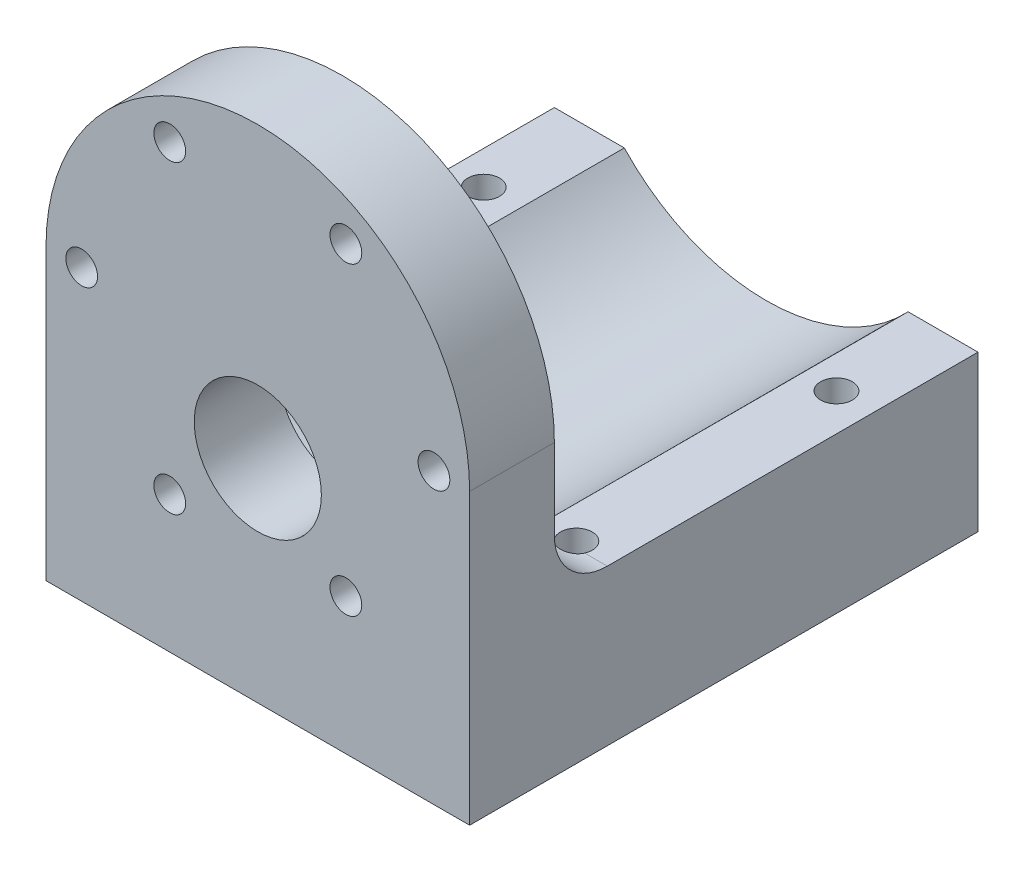
ISO-10303-21;
HEADER;
FILE_DESCRIPTION(('STEP AP214'),'2;1');
FILE_NAME('part.step','',(''),(''),'','','');
FILE_SCHEMA(('AUTOMOTIVE_DESIGN { 1 0 10303 214 1 1 1 1 }'));
ENDSEC;
DATA;
#1=APPLICATION_CONTEXT('core data for automotive mechanical design processes');
#2=APPLICATION_PROTOCOL_DEFINITION('international standard','automotive_design',2000,#1);
#3=PRODUCT_CONTEXT('',#1,'mechanical');
#4=PRODUCT('Part','Part','',(#3));
#5=PRODUCT_RELATED_PRODUCT_CATEGORY('part','',(#4));
#6=PRODUCT_DEFINITION_FORMATION('','',#4);
#7=PRODUCT_DEFINITION_CONTEXT('part definition',#1,'design');
#8=PRODUCT_DEFINITION('design','',#6,#7);
#9=PRODUCT_DEFINITION_SHAPE('','',#8);
#10=(LENGTH_UNIT() NAMED_UNIT(*) SI_UNIT(.MILLI.,.METRE.));
#11=(NAMED_UNIT(*) PLANE_ANGLE_UNIT() SI_UNIT($,.RADIAN.));
#12=(NAMED_UNIT(*) SI_UNIT($,.STERADIAN.) SOLID_ANGLE_UNIT());
#13=UNCERTAINTY_MEASURE_WITH_UNIT(LENGTH_MEASURE(1.E-05),#10,'distance_accuracy_value','');
#14=(GEOMETRIC_REPRESENTATION_CONTEXT(3) GLOBAL_UNCERTAINTY_ASSIGNED_CONTEXT((#13)) GLOBAL_UNIT_ASSIGNED_CONTEXT((#10,
#11,#12)) REPRESENTATION_CONTEXT('',''));
#15=CARTESIAN_POINT('',(0.,0.,0.));
#16=DIRECTION('',(0.,0.,1.));
#17=DIRECTION('',(1.,0.,0.));
#18=AXIS2_PLACEMENT_3D('',#15,#16,#17);
#19=CARTESIAN_POINT('',(20.,27.3,8.));
#20=DIRECTION('',(0.,0.,-1.));
#21=DIRECTION('',(-1.,0.,0.));
#22=AXIS2_PLACEMENT_3D('',#19,#20,#21);
#23=CYLINDRICAL_SURFACE('',#22,20.);
#24=CARTESIAN_POINT('',(20.,27.3,0.));
#25=DIRECTION('',(0.,0.,-1.));
#26=DIRECTION('',(-1.,0.,0.));
#27=AXIS2_PLACEMENT_3D('',#24,#25,#26);
#28=CIRCLE('',#27,20.);
#29=CARTESIAN_POINT('',(0.,27.3,0.));
#30=VERTEX_POINT('',#29);
#31=CARTESIAN_POINT('',(40.,27.3,0.));
#32=VERTEX_POINT('',#31);
#33=EDGE_CURVE('E241',#30,#32,#28,.T.);
#34=ORIENTED_EDGE('',*,*,#33,.F.);
#35=DIRECTION('',(0.,0.,-1.));
#36=VECTOR('',#35,1.);
#37=CARTESIAN_POINT('',(0.,27.3,8.));
#38=LINE('',#37,#36);
#39=CARTESIAN_POINT('',(0.,27.3,8.));
#40=VERTEX_POINT('',#39);
#41=EDGE_CURVE('E271',#40,#30,#38,.T.);
#42=ORIENTED_EDGE('',*,*,#41,.F.);
#43=CARTESIAN_POINT('',(20.,27.3,8.));
#44=DIRECTION('',(0.,0.,-1.));
#45=DIRECTION('',(-1.,0.,0.));
#46=AXIS2_PLACEMENT_3D('',#43,#44,#45);
#47=CIRCLE('',#46,20.);
#48=CARTESIAN_POINT('',(40.,27.3,8.));
#49=VERTEX_POINT('',#48);
#50=EDGE_CURVE('E245',#40,#49,#47,.T.);
#51=ORIENTED_EDGE('',*,*,#50,.T.);
#52=DIRECTION('',(0.,0.,-1.));
#53=VECTOR('',#52,1.);
#54=CARTESIAN_POINT('',(40.,27.3,8.));
#55=LINE('',#54,#53);
#56=EDGE_CURVE('E261',#49,#32,#55,.T.);
#57=ORIENTED_EDGE('',*,*,#56,.T.);
#58=EDGE_LOOP('',(#34,#42,#51,#57));
#59=FACE_BOUND('',#58,.T.);
#60=ADVANCED_FACE('F42',(#59),#23,.T.);
#61=CARTESIAN_POINT('',(0.,0.,8.));
#62=DIRECTION('',(-1.,0.,0.));
#63=DIRECTION('',(0.,0.,1.));
#64=AXIS2_PLACEMENT_3D('',#61,#62,#63);
#65=PLANE('',#64);
#66=DIRECTION('',(0.,1.,0.));
#67=VECTOR('',#66,1.);
#68=CARTESIAN_POINT('',(0.,0.,0.));
#69=LINE('',#68,#67);
#70=CARTESIAN_POINT('',(0.,19.687746699167,0.));
#71=VERTEX_POINT('',#70);
#72=EDGE_CURVE('E250',#71,#30,#69,.T.);
#73=ORIENTED_EDGE('',*,*,#72,.F.);
#74=CARTESIAN_POINT('',(0.,19.687746699167,-5.));
#75=DIRECTION('',(-1.,0.,0.));
#76=DIRECTION('',(0.,0.,1.));
#77=AXIS2_PLACEMENT_3D('',#74,#75,#76);
#78=CIRCLE('',#77,5.);
#79=CARTESIAN_POINT('',(0.,14.687746699167,-5.));
#80=VERTEX_POINT('',#79);
#81=EDGE_CURVE('E12',#71,#80,#78,.F.);
#82=ORIENTED_EDGE('',*,*,#81,.T.);
#83=DIRECTION('',(0.,0.,1.));
#84=VECTOR('',#83,1.);
#85=CARTESIAN_POINT('',(0.,14.687746699167,-40.));
#86=LINE('',#85,#84);
#87=CARTESIAN_POINT('',(0.,14.687746699167,-40.));
#88=VERTEX_POINT('',#87);
#89=EDGE_CURVE('E183',#88,#80,#86,.T.);
#90=ORIENTED_EDGE('',*,*,#89,.F.);
#91=DIRECTION('',(0.,1.,0.));
#92=VECTOR('',#91,1.);
#93=CARTESIAN_POINT('',(0.,0.,-40.));
#94=LINE('',#93,#92);
#95=CARTESIAN_POINT('',(0.,0.,-40.));
#96=VERTEX_POINT('',#95);
#97=EDGE_CURVE('E175',#96,#88,#94,.T.);
#98=ORIENTED_EDGE('',*,*,#97,.F.);
#99=DIRECTION('',(0.,0.,-1.));
#100=VECTOR('',#99,1.);
#101=CARTESIAN_POINT('',(0.,0.,8.));
#102=LINE('',#101,#100);
#103=CARTESIAN_POINT('',(0.,0.,8.));
#104=VERTEX_POINT('',#103);
#105=EDGE_CURVE('E276',#104,#96,#102,.T.);
#106=ORIENTED_EDGE('',*,*,#105,.F.);
#107=DIRECTION('',(0.,1.,0.));
#108=VECTOR('',#107,1.);
#109=CARTESIAN_POINT('',(0.,0.,8.));
#110=LINE('',#109,#108);
#111=EDGE_CURVE('E257',#104,#40,#110,.T.);
#112=ORIENTED_EDGE('',*,*,#111,.T.);
#113=ORIENTED_EDGE('',*,*,#41,.T.);
#114=EDGE_LOOP('',(#73,#82,#90,#98,#106,#112,#113));
#115=FACE_BOUND('',#114,.T.);
#116=ADVANCED_FACE('F363',(#115),#65,.T.);
#117=CARTESIAN_POINT('',(0.,0.,8.));
#118=DIRECTION('',(0.,1.,0.));
#119=DIRECTION('',(0.,0.,1.));
#120=AXIS2_PLACEMENT_3D('',#117,#118,#119);
#121=PLANE('',#120);
#122=CARTESIAN_POINT('',(36.487813402303,0.,-30.1477890218393));
#123=DIRECTION('',(0.,1.,0.));
#124=DIRECTION('',(0.,0.,1.));
#125=AXIS2_PLACEMENT_3D('',#122,#123,#124);
#126=CIRCLE('',#125,1.5);
#127=CARTESIAN_POINT('',(36.487813402303,0.,-28.6477890218393));
#128=VERTEX_POINT('',#127);
#129=EDGE_CURVE('E420',#128,#128,#126,.T.);
#130=ORIENTED_EDGE('',*,*,#129,.T.);
#131=EDGE_LOOP('',(#130));
#132=FACE_BOUND('',#131,.T.);
#133=CARTESIAN_POINT('',(3.17462201183361,0.,-30.1477890218393));
#134=DIRECTION('',(0.,1.,0.));
#135=DIRECTION('',(0.,0.,1.));
#136=AXIS2_PLACEMENT_3D('',#133,#134,#135);
#137=CIRCLE('',#136,1.5);
#138=CARTESIAN_POINT('',(3.17462201183361,0.,-28.6477890218393));
#139=VERTEX_POINT('',#138);
#140=EDGE_CURVE('E407',#139,#139,#137,.T.);
#141=ORIENTED_EDGE('',*,*,#140,.T.);
#142=EDGE_LOOP('',(#141));
#143=FACE_BOUND('',#142,.T.);
#144=CARTESIAN_POINT('',(3.17462201183361,0.,-5.58616004514079));
#145=DIRECTION('',(0.,1.,0.));
#146=DIRECTION('',(0.,0.,1.));
#147=AXIS2_PLACEMENT_3D('',#144,#145,#146);
#148=CIRCLE('',#147,1.5);
#149=CARTESIAN_POINT('',(3.17462201183361,0.,-4.08616004514079));
#150=VERTEX_POINT('',#149);
#151=EDGE_CURVE('E406',#150,#150,#148,.T.);
#152=ORIENTED_EDGE('',*,*,#151,.T.);
#153=EDGE_LOOP('',(#152));
#154=FACE_BOUND('',#153,.T.);
#155=CARTESIAN_POINT('',(36.487813402303,0.,-5.58616004514079));
#156=DIRECTION('',(0.,1.,0.));
#157=DIRECTION('',(0.,0.,1.));
#158=AXIS2_PLACEMENT_3D('',#155,#156,#157);
#159=CIRCLE('',#158,1.5);
#160=CARTESIAN_POINT('',(36.487813402303,0.,-4.08616004514078));
#161=VERTEX_POINT('',#160);
#162=EDGE_CURVE('E163',#161,#161,#159,.T.);
#163=ORIENTED_EDGE('',*,*,#162,.T.);
#164=EDGE_LOOP('',(#163));
#165=FACE_BOUND('',#164,.T.);
#166=ORIENTED_EDGE('',*,*,#105,.T.);
#167=DIRECTION('',(-1.,0.,0.));
#168=VECTOR('',#167,1.);
#169=CARTESIAN_POINT('',(0.,0.,-40.));
#170=LINE('',#169,#168);
#171=CARTESIAN_POINT('',(40.,0.,-40.));
#172=VERTEX_POINT('',#171);
#173=EDGE_CURVE('E171',#172,#96,#170,.T.);
#174=ORIENTED_EDGE('',*,*,#173,.F.);
#175=DIRECTION('',(0.,0.,-1.));
#176=VECTOR('',#175,1.);
#177=CARTESIAN_POINT('',(40.,0.,8.));
#178=LINE('',#177,#176);
#179=CARTESIAN_POINT('',(40.,0.,8.));
#180=VERTEX_POINT('',#179);
#181=EDGE_CURVE('E279',#180,#172,#178,.T.);
#182=ORIENTED_EDGE('',*,*,#181,.F.);
#183=DIRECTION('',(1.,0.,0.));
#184=VECTOR('',#183,1.);
#185=CARTESIAN_POINT('',(0.,0.,8.));
#186=LINE('',#185,#184);
#187=EDGE_CURVE('E254',#104,#180,#186,.T.);
#188=ORIENTED_EDGE('',*,*,#187,.F.);
#189=EDGE_LOOP('',(#166,#174,#182,#188));
#190=FACE_BOUND('',#189,.T.);
#191=ADVANCED_FACE('F368',(#132,#143,#154,#165,#190),#121,.F.);
#192=CARTESIAN_POINT('',(40.,27.3,8.));
#193=DIRECTION('',(1.,0.,0.));
#194=DIRECTION('',(0.,0.,-1.));
#195=AXIS2_PLACEMENT_3D('',#192,#193,#194);
#196=PLANE('',#195);
#197=DIRECTION('',(0.,-1.,0.));
#198=VECTOR('',#197,1.);
#199=CARTESIAN_POINT('',(40.,27.3,0.));
#200=LINE('',#199,#198);
#201=CARTESIAN_POINT('',(40.,19.687746699167,0.));
#202=VERTEX_POINT('',#201);
#203=EDGE_CURVE('E265',#32,#202,#200,.T.);
#204=ORIENTED_EDGE('',*,*,#203,.F.);
#205=ORIENTED_EDGE('',*,*,#56,.F.);
#206=DIRECTION('',(0.,-1.,0.));
#207=VECTOR('',#206,1.);
#208=CARTESIAN_POINT('',(40.,27.3,8.));
#209=LINE('',#208,#207);
#210=EDGE_CURVE('E249',#49,#180,#209,.T.);
#211=ORIENTED_EDGE('',*,*,#210,.T.);
#212=ORIENTED_EDGE('',*,*,#181,.T.);
#213=DIRECTION('',(0.,-1.,0.));
#214=VECTOR('',#213,1.);
#215=CARTESIAN_POINT('',(40.,0.,-40.));
#216=LINE('',#215,#214);
#217=CARTESIAN_POINT('',(40.,14.687746699167,-40.));
#218=VERTEX_POINT('',#217);
#219=EDGE_CURVE('E154',#218,#172,#216,.T.);
#220=ORIENTED_EDGE('',*,*,#219,.F.);
#221=DIRECTION('',(0.,0.,1.));
#222=VECTOR('',#221,1.);
#223=CARTESIAN_POINT('',(40.,14.687746699167,-40.));
#224=LINE('',#223,#222);
#225=CARTESIAN_POINT('',(40.,14.687746699167,-5.));
#226=VERTEX_POINT('',#225);
#227=EDGE_CURVE('E144',#218,#226,#224,.T.);
#228=ORIENTED_EDGE('',*,*,#227,.T.);
#229=CARTESIAN_POINT('',(40.,19.687746699167,-5.));
#230=DIRECTION('',(1.,0.,0.));
#231=DIRECTION('',(0.,0.,-1.));
#232=AXIS2_PLACEMENT_3D('',#229,#230,#231);
#233=CIRCLE('',#232,5.);
#234=EDGE_CURVE('E300',#226,#202,#233,.F.);
#235=ORIENTED_EDGE('',*,*,#234,.T.);
#236=EDGE_LOOP('',(#204,#205,#211,#212,#220,#228,#235));
#237=FACE_BOUND('',#236,.T.);
#238=ADVANCED_FACE('F386',(#237),#196,.T.);
#239=CARTESIAN_POINT('',(20.,27.3,8.));
#240=DIRECTION('',(0.,0.,-1.));
#241=DIRECTION('',(-1.,0.,0.));
#242=AXIS2_PLACEMENT_3D('',#239,#240,#241);
#243=PLANE('',#242);
#244=CARTESIAN_POINT('',(3.36999999999998,27.3,8.));
#245=DIRECTION('',(0.,0.,1.));
#246=DIRECTION('',(1.,0.,0.));
#247=AXIS2_PLACEMENT_3D('',#244,#245,#246);
#248=CIRCLE('',#247,1.5);
#249=CARTESIAN_POINT('',(4.86999999999998,27.3,8.));
#250=VERTEX_POINT('',#249);
#251=EDGE_CURVE('E205',#250,#250,#248,.T.);
#252=ORIENTED_EDGE('',*,*,#251,.F.);
#253=EDGE_LOOP('',(#252));
#254=FACE_BOUND('',#253,.T.);
#255=CARTESIAN_POINT('',(11.6850000000003,41.7020024649359,8.));
#256=DIRECTION('',(0.,0.,1.));
#257=DIRECTION('',(1.,0.,0.));
#258=AXIS2_PLACEMENT_3D('',#255,#256,#257);
#259=CIRCLE('',#258,1.5);
#260=CARTESIAN_POINT('',(13.1850000000003,41.7020024649359,8.));
#261=VERTEX_POINT('',#260);
#262=EDGE_CURVE('E214',#261,#261,#259,.T.);
#263=ORIENTED_EDGE('',*,*,#262,.F.);
#264=EDGE_LOOP('',(#263));
#265=FACE_BOUND('',#264,.T.);
#266=CARTESIAN_POINT('',(28.3150000000012,41.7020024649359,8.));
#267=DIRECTION('',(0.,0.,1.));
#268=DIRECTION('',(1.,0.,0.));
#269=AXIS2_PLACEMENT_3D('',#266,#267,#268);
#270=CIRCLE('',#269,1.5);
#271=CARTESIAN_POINT('',(29.8150000000012,41.7020024649359,8.));
#272=VERTEX_POINT('',#271);
#273=EDGE_CURVE('E222',#272,#272,#270,.T.);
#274=ORIENTED_EDGE('',*,*,#273,.F.);
#275=EDGE_LOOP('',(#274));
#276=FACE_BOUND('',#275,.T.);
#277=CARTESIAN_POINT('',(36.6300000000016,27.3,8.));
#278=DIRECTION('',(0.,0.,1.));
#279=DIRECTION('',(1.,0.,0.));
#280=AXIS2_PLACEMENT_3D('',#277,#278,#279);
#281=CIRCLE('',#280,1.5);
#282=CARTESIAN_POINT('',(38.1300000000015,27.3,8.));
#283=VERTEX_POINT('',#282);
#284=EDGE_CURVE('E230',#283,#283,#281,.T.);
#285=ORIENTED_EDGE('',*,*,#284,.F.);
#286=EDGE_LOOP('',(#285));
#287=FACE_BOUND('',#286,.T.);
#288=CARTESIAN_POINT('',(11.6850000000004,12.8979975350641,8.));
#289=DIRECTION('',(0.,0.,1.));
#290=DIRECTION('',(1.,0.,0.));
#291=AXIS2_PLACEMENT_3D('',#288,#289,#290);
#292=CIRCLE('',#291,1.5);
#293=CARTESIAN_POINT('',(13.1850000000004,12.8979975350641,8.));
#294=VERTEX_POINT('',#293);
#295=EDGE_CURVE('E198',#294,#294,#292,.T.);
#296=ORIENTED_EDGE('',*,*,#295,.F.);
#297=EDGE_LOOP('',(#296));
#298=FACE_BOUND('',#297,.T.);
#299=CARTESIAN_POINT('',(28.3150000000012,12.8979975350641,8.));
#300=DIRECTION('',(0.,0.,1.));
#301=DIRECTION('',(1.,0.,0.));
#302=AXIS2_PLACEMENT_3D('',#299,#300,#301);
#303=CIRCLE('',#302,1.5);
#304=CARTESIAN_POINT('',(29.8150000000012,12.8979975350641,8.));
#305=VERTEX_POINT('',#304);
#306=EDGE_CURVE('E189',#305,#305,#303,.T.);
#307=ORIENTED_EDGE('',*,*,#306,.F.);
#308=EDGE_LOOP('',(#307));
#309=FACE_BOUND('',#308,.T.);
#310=CARTESIAN_POINT('',(20.,20.,8.));
#311=DIRECTION('',(0.,0.,1.));
#312=DIRECTION('',(1.,0.,0.));
#313=AXIS2_PLACEMENT_3D('',#310,#311,#312);
#314=CIRCLE('',#313,6.);
#315=CARTESIAN_POINT('',(26.,20.,8.));
#316=VERTEX_POINT('',#315);
#317=EDGE_CURVE('E237',#316,#316,#314,.T.);
#318=ORIENTED_EDGE('',*,*,#317,.F.);
#319=EDGE_LOOP('',(#318));
#320=FACE_BOUND('',#319,.T.);
#321=ORIENTED_EDGE('',*,*,#50,.F.);
#322=ORIENTED_EDGE('',*,*,#111,.F.);
#323=ORIENTED_EDGE('',*,*,#187,.T.);
#324=ORIENTED_EDGE('',*,*,#210,.F.);
#325=EDGE_LOOP('',(#321,#322,#323,#324));
#326=FACE_BOUND('',#325,.T.);
#327=ADVANCED_FACE('F382',(#254,#265,#276,#287,#298,#309,#320,#326),#243,.F.);
#328=CARTESIAN_POINT('',(20.,27.3,0.));
#329=DIRECTION('',(0.,0.,-1.));
#330=DIRECTION('',(-1.,0.,0.));
#331=AXIS2_PLACEMENT_3D('',#328,#329,#330);
#332=PLANE('',#331);
#333=CARTESIAN_POINT('',(20.,27.3,0.));
#334=DIRECTION('',(0.,0.,-1.));
#335=DIRECTION('',(-1.,0.,0.));
#336=AXIS2_PLACEMENT_3D('',#333,#334,#335);
#337=CIRCLE('',#336,18.4);
#338=CARTESIAN_POINT('',(36.7515252942518,19.687746699167,0.));
#339=VERTEX_POINT('',#338);
#340=CARTESIAN_POINT('',(3.24847470574823,19.687746699167,0.));
#341=VERTEX_POINT('',#340);
#342=EDGE_CURVE('E59',#339,#341,#337,.T.);
#343=ORIENTED_EDGE('',*,*,#342,.T.);
#344=DIRECTION('',(1.,0.,0.));
#345=VECTOR('',#344,1.);
#346=CARTESIAN_POINT('',(20.,19.687746699167,0.));
#347=LINE('',#346,#345);
#348=EDGE_CURVE('E64',#341,#71,#347,.F.);
#349=ORIENTED_EDGE('',*,*,#348,.T.);
#350=ORIENTED_EDGE('',*,*,#72,.T.);
#351=ORIENTED_EDGE('',*,*,#33,.T.);
#352=ORIENTED_EDGE('',*,*,#203,.T.);
#353=DIRECTION('',(1.,0.,0.));
#354=VECTOR('',#353,1.);
#355=CARTESIAN_POINT('',(20.,19.687746699167,0.));
#356=LINE('',#355,#354);
#357=EDGE_CURVE('E289',#202,#339,#356,.F.);
#358=ORIENTED_EDGE('',*,*,#357,.T.);
#359=EDGE_LOOP('',(#343,#349,#350,#351,#352,#358));
#360=FACE_BOUND('',#359,.T.);
#361=CARTESIAN_POINT('',(3.36999999999998,27.3,0.));
#362=DIRECTION('',(0.,0.,1.));
#363=DIRECTION('',(1.,0.,0.));
#364=AXIS2_PLACEMENT_3D('',#361,#362,#363);
#365=CIRCLE('',#364,1.5);
#366=CARTESIAN_POINT('',(4.86999999999998,27.3,0.));
#367=VERTEX_POINT('',#366);
#368=EDGE_CURVE('E210',#367,#367,#365,.T.);
#369=ORIENTED_EDGE('',*,*,#368,.T.);
#370=EDGE_LOOP('',(#369));
#371=FACE_BOUND('',#370,.T.);
#372=CARTESIAN_POINT('',(11.6850000000003,41.7020024649359,0.));
#373=DIRECTION('',(0.,0.,1.));
#374=DIRECTION('',(1.,0.,0.));
#375=AXIS2_PLACEMENT_3D('',#372,#373,#374);
#376=CIRCLE('',#375,1.5);
#377=CARTESIAN_POINT('',(13.1850000000003,41.7020024649359,0.));
#378=VERTEX_POINT('',#377);
#379=EDGE_CURVE('E218',#378,#378,#376,.T.);
#380=ORIENTED_EDGE('',*,*,#379,.T.);
#381=EDGE_LOOP('',(#380));
#382=FACE_BOUND('',#381,.T.);
#383=CARTESIAN_POINT('',(28.3150000000012,41.7020024649359,0.));
#384=DIRECTION('',(0.,0.,1.));
#385=DIRECTION('',(1.,0.,0.));
#386=AXIS2_PLACEMENT_3D('',#383,#384,#385);
#387=CIRCLE('',#386,1.5);
#388=CARTESIAN_POINT('',(29.8150000000012,41.7020024649359,0.));
#389=VERTEX_POINT('',#388);
#390=EDGE_CURVE('E226',#389,#389,#387,.T.);
#391=ORIENTED_EDGE('',*,*,#390,.T.);
#392=EDGE_LOOP('',(#391));
#393=FACE_BOUND('',#392,.T.);
#394=CARTESIAN_POINT('',(36.6300000000016,27.3,0.));
#395=DIRECTION('',(0.,0.,1.));
#396=DIRECTION('',(1.,0.,0.));
#397=AXIS2_PLACEMENT_3D('',#394,#395,#396);
#398=CIRCLE('',#397,1.5);
#399=CARTESIAN_POINT('',(38.1300000000015,27.3,0.));
#400=VERTEX_POINT('',#399);
#401=EDGE_CURVE('E193',#400,#400,#398,.T.);
#402=ORIENTED_EDGE('',*,*,#401,.T.);
#403=EDGE_LOOP('',(#402));
#404=FACE_BOUND('',#403,.T.);
#405=CARTESIAN_POINT('',(11.6850000000004,12.8979975350641,0.));
#406=DIRECTION('',(0.,0.,1.));
#407=DIRECTION('',(1.,0.,0.));
#408=AXIS2_PLACEMENT_3D('',#405,#406,#407);
#409=CIRCLE('',#408,1.5);
#410=CARTESIAN_POINT('',(13.1850000000004,12.8979975350641,0.));
#411=VERTEX_POINT('',#410);
#412=EDGE_CURVE('E143',#411,#411,#409,.T.);
#413=ORIENTED_EDGE('',*,*,#412,.T.);
#414=EDGE_LOOP('',(#413));
#415=FACE_BOUND('',#414,.T.);
#416=CARTESIAN_POINT('',(28.3150000000012,12.8979975350641,0.));
#417=DIRECTION('',(0.,0.,1.));
#418=DIRECTION('',(1.,0.,0.));
#419=AXIS2_PLACEMENT_3D('',#416,#417,#418);
#420=CIRCLE('',#419,1.5);
#421=CARTESIAN_POINT('',(29.8150000000012,12.8979975350641,0.));
#422=VERTEX_POINT('',#421);
#423=EDGE_CURVE('E194',#422,#422,#420,.T.);
#424=ORIENTED_EDGE('',*,*,#423,.T.);
#425=EDGE_LOOP('',(#424));
#426=FACE_BOUND('',#425,.T.);
#427=CARTESIAN_POINT('',(20.,20.,0.));
#428=DIRECTION('',(0.,0.,1.));
#429=DIRECTION('',(1.,0.,0.));
#430=AXIS2_PLACEMENT_3D('',#427,#428,#429);
#431=CIRCLE('',#430,6.);
#432=CARTESIAN_POINT('',(26.,20.,0.));
#433=VERTEX_POINT('',#432);
#434=EDGE_CURVE('E209',#433,#433,#431,.T.);
#435=ORIENTED_EDGE('',*,*,#434,.T.);
#436=EDGE_LOOP('',(#435));
#437=FACE_BOUND('',#436,.T.);
#438=ADVANCED_FACE('F374',(#360,#371,#382,#393,#404,#415,#426,#437),#332,.T.);
#439=CARTESIAN_POINT('',(20.,20.,8.));
#440=DIRECTION('',(0.,0.,-1.));
#441=DIRECTION('',(-1.,0.,0.));
#442=AXIS2_PLACEMENT_3D('',#439,#440,#441);
#443=CYLINDRICAL_SURFACE('',#442,6.);
#444=ORIENTED_EDGE('',*,*,#317,.T.);
#445=EDGE_LOOP('',(#444));
#446=FACE_BOUND('',#445,.T.);
#447=ORIENTED_EDGE('',*,*,#434,.F.);
#448=EDGE_LOOP('',(#447));
#449=FACE_BOUND('',#448,.T.);
#450=ADVANCED_FACE('F472',(#446,#449),#443,.F.);
#451=CARTESIAN_POINT('',(28.3150000000012,12.8979975350641,8.));
#452=DIRECTION('',(0.,0.,-1.));
#453=DIRECTION('',(-1.,0.,0.));
#454=AXIS2_PLACEMENT_3D('',#451,#452,#453);
#455=CYLINDRICAL_SURFACE('',#454,1.5);
#456=ORIENTED_EDGE('',*,*,#306,.T.);
#457=EDGE_LOOP('',(#456));
#458=FACE_BOUND('',#457,.T.);
#459=ORIENTED_EDGE('',*,*,#423,.F.);
#460=EDGE_LOOP('',(#459));
#461=FACE_BOUND('',#460,.T.);
#462=ADVANCED_FACE('F329',(#458,#461),#455,.F.);
#463=CARTESIAN_POINT('',(11.6850000000004,12.8979975350641,8.));
#464=DIRECTION('',(0.,0.,-1.));
#465=DIRECTION('',(-1.,0.,0.));
#466=AXIS2_PLACEMENT_3D('',#463,#464,#465);
#467=CYLINDRICAL_SURFACE('',#466,1.5);
#468=ORIENTED_EDGE('',*,*,#295,.T.);
#469=EDGE_LOOP('',(#468));
#470=FACE_BOUND('',#469,.T.);
#471=ORIENTED_EDGE('',*,*,#412,.F.);
#472=EDGE_LOOP('',(#471));
#473=FACE_BOUND('',#472,.T.);
#474=ADVANCED_FACE('F557',(#470,#473),#467,.F.);
#475=CARTESIAN_POINT('',(36.6300000000016,27.3,8.));
#476=DIRECTION('',(0.,0.,-1.));
#477=DIRECTION('',(-1.,0.,0.));
#478=AXIS2_PLACEMENT_3D('',#475,#476,#477);
#479=CYLINDRICAL_SURFACE('',#478,1.5);
#480=ORIENTED_EDGE('',*,*,#284,.T.);
#481=EDGE_LOOP('',(#480));
#482=FACE_BOUND('',#481,.T.);
#483=ORIENTED_EDGE('',*,*,#401,.F.);
#484=EDGE_LOOP('',(#483));
#485=FACE_BOUND('',#484,.T.);
#486=ADVANCED_FACE('F566',(#482,#485),#479,.F.);
#487=CARTESIAN_POINT('',(28.3150000000012,41.7020024649359,8.));
#488=DIRECTION('',(0.,0.,-1.));
#489=DIRECTION('',(-1.,0.,0.));
#490=AXIS2_PLACEMENT_3D('',#487,#488,#489);
#491=CYLINDRICAL_SURFACE('',#490,1.5);
#492=ORIENTED_EDGE('',*,*,#273,.T.);
#493=EDGE_LOOP('',(#492));
#494=FACE_BOUND('',#493,.T.);
#495=ORIENTED_EDGE('',*,*,#390,.F.);
#496=EDGE_LOOP('',(#495));
#497=FACE_BOUND('',#496,.T.);
#498=ADVANCED_FACE('F575',(#494,#497),#491,.F.);
#499=CARTESIAN_POINT('',(11.6850000000003,41.7020024649359,8.));
#500=DIRECTION('',(0.,0.,-1.));
#501=DIRECTION('',(-1.,0.,0.));
#502=AXIS2_PLACEMENT_3D('',#499,#500,#501);
#503=CYLINDRICAL_SURFACE('',#502,1.5);
#504=ORIENTED_EDGE('',*,*,#262,.T.);
#505=EDGE_LOOP('',(#504));
#506=FACE_BOUND('',#505,.T.);
#507=ORIENTED_EDGE('',*,*,#379,.F.);
#508=EDGE_LOOP('',(#507));
#509=FACE_BOUND('',#508,.T.);
#510=ADVANCED_FACE('F585',(#506,#509),#503,.F.);
#511=CARTESIAN_POINT('',(3.36999999999998,27.3,8.));
#512=DIRECTION('',(0.,0.,-1.));
#513=DIRECTION('',(-1.,0.,0.));
#514=AXIS2_PLACEMENT_3D('',#511,#512,#513);
#515=CYLINDRICAL_SURFACE('',#514,1.5);
#516=ORIENTED_EDGE('',*,*,#251,.T.);
#517=EDGE_LOOP('',(#516));
#518=FACE_BOUND('',#517,.T.);
#519=ORIENTED_EDGE('',*,*,#368,.F.);
#520=EDGE_LOOP('',(#519));
#521=FACE_BOUND('',#520,.T.);
#522=ADVANCED_FACE('F327',(#518,#521),#515,.F.);
#523=CARTESIAN_POINT('',(20.,27.3,-40.));
#524=DIRECTION('',(0.,0.,1.));
#525=DIRECTION('',(1.,0.,0.));
#526=AXIS2_PLACEMENT_3D('',#523,#524,#525);
#527=CYLINDRICAL_SURFACE('',#526,18.4);
#528=ORIENTED_EDGE('',*,*,#342,.F.);
#529=CARTESIAN_POINT('',(36.7515252942518,19.687746699167,0.));
#530=CARTESIAN_POINT('',(36.6792711315311,19.5286882841438,4.62902597672867E-06));
#531=CARTESIAN_POINT('',(36.6047347179759,19.3707317598901,-0.00758831087559126));
#532=CARTESIAN_POINT('',(36.4518295894709,19.0581966460606,-0.0373117517891198));
#533=CARTESIAN_POINT('',(36.3734634500744,18.9036158847563,-0.0594326037571304));
#534=CARTESIAN_POINT('',(36.2138491658719,18.599394423471,-0.117441244105118));
#535=CARTESIAN_POINT('',(36.1326136244023,18.4497366255919,-0.153274321058306));
#536=CARTESIAN_POINT('',(35.9677209643673,18.1555830687301,-0.238076572261291));
#537=CARTESIAN_POINT('',(35.8840634336658,18.0110881977509,-0.287047994049129));
#538=CARTESIAN_POINT('',(35.6310768133103,17.5872687319824,-0.452496359699962));
#539=CARTESIAN_POINT('',(35.4591805111668,17.3165641297152,-0.587712807215266));
#540=CARTESIAN_POINT('',(35.1151551741208,16.8029574034329,-0.90495148602826));
#541=CARTESIAN_POINT('',(34.9430267382623,16.5601312284345,-1.08709738851599));
#542=CARTESIAN_POINT('',(34.6857931208627,16.2135107567904,-1.40053335845297));
#543=CARTESIAN_POINT('',(34.5974655340311,16.0976013578719,-1.51604644046094));
#544=CARTESIAN_POINT('',(34.4249099178488,15.8762694302363,-1.75967049441247));
#545=CARTESIAN_POINT('',(34.3406829065371,15.7708494989992,-1.88778457116772));
#546=CARTESIAN_POINT('',(34.1785109093471,15.5719885038374,-2.15600458436112));
#547=CARTESIAN_POINT('',(34.1005482480312,15.4785132621925,-2.29607430201041));
#548=CARTESIAN_POINT('',(33.9529079568846,15.3046104741473,-2.58814779206737));
#549=CARTESIAN_POINT('',(33.8832290194602,15.2241808677486,-2.74014967466528));
#550=CARTESIAN_POINT('',(33.7393627297323,15.0605364255715,-3.09338143693077));
#551=CARTESIAN_POINT('',(33.6680716995764,14.9812423414433,-3.29769942699533));
#552=CARTESIAN_POINT('',(33.5779394025587,14.8822082616982,-3.61469844203464));
#553=CARTESIAN_POINT('',(33.5507140467381,14.8525336424706,-3.72201079402236));
#554=CARTESIAN_POINT('',(33.5024426763022,14.8001877218919,-3.93967699804984));
#555=CARTESIAN_POINT('',(33.4813947678477,14.7775142740586,-4.05002990656406));
#556=CARTESIAN_POINT('',(33.4420005239794,14.7352214310386,-4.2987058810945));
#557=CARTESIAN_POINT('',(33.425379806522,14.7174938995746,-4.43764126762244));
#558=CARTESIAN_POINT('',(33.4086587285979,14.6996853758678,-4.64756642241767));
#559=CARTESIAN_POINT('',(33.4044532542541,14.6952129144055,-4.71790358787312));
#560=CARTESIAN_POINT('',(33.3988360218057,14.6892425943226,-4.85882121952235));
#561=CARTESIAN_POINT('',(33.3974245084012,14.6877449962457,-4.92940170648441));
#562=CARTESIAN_POINT('',(33.3974276141215,14.687746699167,-5.));
#563=B_SPLINE_CURVE_WITH_KNOTS('',3,(#529,#530,#531,#532,#533,#534,#535,#536,#537,#538,#539,
#540,#541,#542,#543,#544,#545,#546,#547,#548,#549,#550,#551,#552,#553,#554,#555,#556,#557,#558,
#559,#560,#561,#562),.UNSPECIFIED.,.F.,.F.,(4,2,2,2,2,2,2,2,2,2,2,2,2,2,2,2,4),(0.,
0.52383056976933,1.04731357689353,1.56872931849374,2.09023431409017,3.12968591372291,
4.17190526361761,4.72913715139885,5.28650668346407,5.84224387543566,6.39789322695045,
7.08622120534,7.42972868569922,7.77313074563739,8.195260443086,8.4069720211248,
8.61870214041337),.UNSPECIFIED.);
#564=CARTESIAN_POINT('',(33.3974276141215,14.687746699167,-5.));
#565=VERTEX_POINT('',#564);
#566=EDGE_CURVE('E138',#339,#565,#563,.T.);
#567=ORIENTED_EDGE('',*,*,#566,.T.);
#568=DIRECTION('',(0.,0.,1.));
#569=VECTOR('',#568,1.);
#570=CARTESIAN_POINT('',(33.3974276141215,14.687746699167,-40.));
#571=LINE('',#570,#569);
#572=CARTESIAN_POINT('',(33.3974276141215,14.687746699167,-40.));
#573=VERTEX_POINT('',#572);
#574=EDGE_CURVE('E131',#573,#565,#571,.T.);
#575=ORIENTED_EDGE('',*,*,#574,.F.);
#576=CARTESIAN_POINT('',(20.,27.3,-40.));
#577=DIRECTION('',(0.,0.,-1.));
#578=DIRECTION('',(-1.,0.,0.));
#579=AXIS2_PLACEMENT_3D('',#576,#577,#578);
#580=CIRCLE('',#579,18.4);
#581=CARTESIAN_POINT('',(6.60257238587845,14.687746699167,-40.));
#582=VERTEX_POINT('',#581);
#583=EDGE_CURVE('E136',#573,#582,#580,.T.);
#584=ORIENTED_EDGE('',*,*,#583,.T.);
#585=DIRECTION('',(0.,0.,1.));
#586=VECTOR('',#585,1.);
#587=CARTESIAN_POINT('',(6.60257238587845,14.687746699167,-40.));
#588=LINE('',#587,#586);
#589=CARTESIAN_POINT('',(6.60257238587845,14.687746699167,-5.));
#590=VERTEX_POINT('',#589);
#591=EDGE_CURVE('E179',#582,#590,#588,.T.);
#592=ORIENTED_EDGE('',*,*,#591,.T.);
#593=CARTESIAN_POINT('',(6.60257238587845,14.687746699167,-5.));
#594=CARTESIAN_POINT('',(6.60261507008038,14.6877167733571,-4.88257975822932));
#595=CARTESIAN_POINT('',(6.59867988749116,14.691881802433,-4.7651888067228));
#596=CARTESIAN_POINT('',(6.58318159222066,14.7083672841439,-4.53160347380308));
#597=CARTESIAN_POINT('',(6.5716262018934,14.720679480445,-4.41540800182953));
#598=CARTESIAN_POINT('',(6.5413610142251,14.7530684270605,-4.18622254784771));
#599=CARTESIAN_POINT('',(6.52272142834043,14.7730689994487,-4.07321244084693));
#600=CARTESIAN_POINT('',(6.47884603062275,14.8204390359411,-3.85006842388213));
#601=CARTESIAN_POINT('',(6.45360887986512,14.8478099958422,-3.73993510273535));
#602=CARTESIAN_POINT('',(6.36918469890782,14.9400726428002,-3.41575691710545));
#603=CARTESIAN_POINT('',(6.30112977353844,15.0152757092413,-3.20683510545721));
#604=CARTESIAN_POINT('',(6.14689111135295,15.1894696919477,-2.80601269420093));
#605=CARTESIAN_POINT('',(6.06065482269028,15.2885296855919,-2.61416377953401));
#606=CARTESIAN_POINT('',(5.83633226777033,15.5530171150381,-2.17242180109611));
#607=CARTESIAN_POINT('',(5.69168216428436,15.7288438165795,-1.93199771146807));
#608=CARTESIAN_POINT('',(5.46435294700159,16.0177042464388,-1.60112987587675));
#609=CARTESIAN_POINT('',(5.38675990996647,16.1183021596244,-1.49570258429739));
#610=CARTESIAN_POINT('',(5.22918649976337,16.3272988503395,-1.29481813557356));
#611=CARTESIAN_POINT('',(5.14920635406594,16.4356968859657,-1.19936003232825));
#612=CARTESIAN_POINT('',(4.90472070584657,16.7752226340454,-0.92535510137253));
#613=CARTESIAN_POINT('',(4.73804149364141,17.0177167204462,-0.762550003399314));
#614=CARTESIAN_POINT('',(4.40655232089218,17.5277598600084,-0.481255730340518));
#615=CARTESIAN_POINT('',(4.24173989156681,17.7952700302869,-0.362699165056675));
#616=CARTESIAN_POINT('',(4.0070107555648,18.2002143624216,-0.224504504445692));
#617=CARTESIAN_POINT('',(3.93401517056464,18.3296820194229,-0.186058601930132));
#618=CARTESIAN_POINT('',(3.79011936207411,18.5924078001721,-0.119571336852884));
#619=CARTESIAN_POINT('',(3.71921876905119,18.7256652472078,-0.0915281291701897));
#620=CARTESIAN_POINT('',(3.57985894678733,18.9956593971689,-0.0462345070468893));
#621=CARTESIAN_POINT('',(3.51140572385266,19.132403414124,-0.0290091279299172));
#622=CARTESIAN_POINT('',(3.37753635766408,19.4083984842054,-0.0058872538596276));
#623=CARTESIAN_POINT('',(3.31212183390802,19.5476508205204,3.26618695830729E-06));
#624=CARTESIAN_POINT('',(3.24847470574823,19.687746699167,0.));
#625=B_SPLINE_CURVE_WITH_KNOTS('',3,(#593,#594,#595,#596,#597,#598,#599,#600,#601,#602,#603,
#604,#605,#606,#607,#608,#609,#610,#611,#612,#613,#614,#615,#616,#617,#618,#619,#620,#621,#622,
#623,#624),.UNSPECIFIED.,.F.,.F.,(4,2,2,2,2,2,2,2,2,2,2,2,2,2,2,4),(0.,0.352073548704365,
0.703790851605508,1.05210953626847,1.40049896445619,2.0939580864373,2.78944977401965,
3.7770841766592,4.27198996148979,4.766848735764,5.77163689009841,6.77488845357157,
7.23511361654663,7.69525711052932,8.15646161194418,8.61790916003431),.UNSPECIFIED.);
#626=EDGE_CURVE('E52',#590,#341,#625,.T.);
#627=ORIENTED_EDGE('',*,*,#626,.T.);
#628=EDGE_LOOP('',(#528,#567,#575,#584,#592,#627));
#629=FACE_BOUND('',#628,.T.);
#630=ADVANCED_FACE('F133',(#629),#527,.F.);
#631=CARTESIAN_POINT('',(0.,14.687746699167,-40.));
#632=DIRECTION('',(0.,-1.,0.));
#633=DIRECTION('',(0.,0.,-1.));
#634=AXIS2_PLACEMENT_3D('',#631,#632,#633);
#635=PLANE('',#634);
#636=CARTESIAN_POINT('',(36.487813402303,14.687746699167,-30.1477890218393));
#637=DIRECTION('',(0.,1.,0.));
#638=DIRECTION('',(0.,0.,1.));
#639=AXIS2_PLACEMENT_3D('',#636,#637,#638);
#640=CIRCLE('',#639,1.5);
#641=CARTESIAN_POINT('',(36.487813402303,14.687746699167,-28.6477890218393));
#642=VERTEX_POINT('',#641);
#643=EDGE_CURVE('E424',#642,#642,#640,.T.);
#644=ORIENTED_EDGE('',*,*,#643,.F.);
#645=EDGE_LOOP('',(#644));
#646=FACE_BOUND('',#645,.T.);
#647=ORIENTED_EDGE('',*,*,#574,.T.);
#648=DIRECTION('',(1.,0.,0.));
#649=VECTOR('',#648,1.);
#650=CARTESIAN_POINT('',(0.,14.687746699167,-5.));
#651=LINE('',#650,#649);
#652=CARTESIAN_POINT('',(35.1070830153409,14.687746699167,-5.));
#653=VERTEX_POINT('',#652);
#654=EDGE_CURVE('E286',#565,#653,#651,.T.);
#655=ORIENTED_EDGE('',*,*,#654,.T.);
#656=CARTESIAN_POINT('',(36.487813402303,14.687746699167,-5.58616004514079));
#657=DIRECTION('',(0.,1.,0.));
#658=DIRECTION('',(0.,0.,1.));
#659=AXIS2_PLACEMENT_3D('',#656,#657,#658);
#660=CIRCLE('',#659,1.5);
#661=CARTESIAN_POINT('',(37.8685437892651,14.687746699167,-5.));
#662=VERTEX_POINT('',#661);
#663=EDGE_CURVE('E166',#662,#653,#660,.T.);
#664=ORIENTED_EDGE('',*,*,#663,.F.);
#665=DIRECTION('',(1.,0.,0.));
#666=VECTOR('',#665,1.);
#667=CARTESIAN_POINT('',(0.,14.687746699167,-5.));
#668=LINE('',#667,#666);
#669=EDGE_CURVE('E275',#662,#226,#668,.T.);
#670=ORIENTED_EDGE('',*,*,#669,.T.);
#671=ORIENTED_EDGE('',*,*,#227,.F.);
#672=DIRECTION('',(1.,0.,0.));
#673=VECTOR('',#672,1.);
#674=CARTESIAN_POINT('',(0.,14.687746699167,-40.));
#675=LINE('',#674,#673);
#676=EDGE_CURVE('E147',#573,#218,#675,.T.);
#677=ORIENTED_EDGE('',*,*,#676,.F.);
#678=EDGE_LOOP('',(#647,#655,#664,#670,#671,#677));
#679=FACE_BOUND('',#678,.T.);
#680=ADVANCED_FACE('F148',(#646,#679),#635,.F.);
#681=CARTESIAN_POINT('',(0.,14.687746699167,-40.));
#682=DIRECTION('',(0.,-1.,0.));
#683=DIRECTION('',(1.,0.,0.));
#684=AXIS2_PLACEMENT_3D('',#681,#682,#683);
#685=PLANE('',#684);
#686=CARTESIAN_POINT('',(3.17462201183361,14.687746699167,-30.1477890218393));
#687=DIRECTION('',(0.,1.,0.));
#688=DIRECTION('',(0.,0.,1.));
#689=AXIS2_PLACEMENT_3D('',#686,#687,#688);
#690=CIRCLE('',#689,1.5);
#691=CARTESIAN_POINT('',(3.17462201183361,14.687746699167,-28.6477890218393));
#692=VERTEX_POINT('',#691);
#693=EDGE_CURVE('E414',#692,#692,#690,.T.);
#694=ORIENTED_EDGE('',*,*,#693,.F.);
#695=EDGE_LOOP('',(#694));
#696=FACE_BOUND('',#695,.T.);
#697=ORIENTED_EDGE('',*,*,#89,.T.);
#698=DIRECTION('',(1.,0.,0.));
#699=VECTOR('',#698,1.);
#700=CARTESIAN_POINT('',(0.,14.687746699167,-5.));
#701=LINE('',#700,#699);
#702=CARTESIAN_POINT('',(1.79389162487149,14.687746699167,-5.));
#703=VERTEX_POINT('',#702);
#704=EDGE_CURVE('E392',#80,#703,#701,.T.);
#705=ORIENTED_EDGE('',*,*,#704,.T.);
#706=CARTESIAN_POINT('',(3.17462201183361,14.687746699167,-5.58616004514079));
#707=DIRECTION('',(0.,1.,0.));
#708=DIRECTION('',(0.,0.,1.));
#709=AXIS2_PLACEMENT_3D('',#706,#707,#708);
#710=CIRCLE('',#709,1.5);
#711=CARTESIAN_POINT('',(4.55535239879572,14.687746699167,-5.));
#712=VERTEX_POINT('',#711);
#713=EDGE_CURVE('E400',#712,#703,#710,.T.);
#714=ORIENTED_EDGE('',*,*,#713,.F.);
#715=DIRECTION('',(1.,0.,0.));
#716=VECTOR('',#715,1.);
#717=CARTESIAN_POINT('',(0.,14.687746699167,-5.));
#718=LINE('',#717,#716);
#719=EDGE_CURVE('E321',#712,#590,#718,.T.);
#720=ORIENTED_EDGE('',*,*,#719,.T.);
#721=ORIENTED_EDGE('',*,*,#591,.F.);
#722=DIRECTION('',(1.,0.,0.));
#723=VECTOR('',#722,1.);
#724=CARTESIAN_POINT('',(0.,14.687746699167,-40.));
#725=LINE('',#724,#723);
#726=EDGE_CURVE('E158',#88,#582,#725,.T.);
#727=ORIENTED_EDGE('',*,*,#726,.F.);
#728=EDGE_LOOP('',(#697,#705,#714,#720,#721,#727));
#729=FACE_BOUND('',#728,.T.);
#730=ADVANCED_FACE('F399',(#696,#729),#685,.F.);
#731=CARTESIAN_POINT('',(0.,0.,-40.));
#732=DIRECTION('',(0.,0.,-1.));
#733=DIRECTION('',(-1.,0.,0.));
#734=AXIS2_PLACEMENT_3D('',#731,#732,#733);
#735=PLANE('',#734);
#736=ORIENTED_EDGE('',*,*,#583,.F.);
#737=ORIENTED_EDGE('',*,*,#676,.T.);
#738=ORIENTED_EDGE('',*,*,#219,.T.);
#739=ORIENTED_EDGE('',*,*,#173,.T.);
#740=ORIENTED_EDGE('',*,*,#97,.T.);
#741=ORIENTED_EDGE('',*,*,#726,.T.);
#742=EDGE_LOOP('',(#736,#737,#738,#739,#740,#741));
#743=FACE_BOUND('',#742,.T.);
#744=ADVANCED_FACE('F156',(#743),#735,.T.);
#745=CARTESIAN_POINT('',(3.17462201183361,0.,-5.58616004514079));
#746=DIRECTION('',(0.,1.,0.));
#747=DIRECTION('',(0.,0.,1.));
#748=AXIS2_PLACEMENT_3D('',#745,#746,#747);
#749=CYLINDRICAL_SURFACE('',#748,1.5);
#750=ORIENTED_EDGE('',*,*,#151,.F.);
#751=EDGE_LOOP('',(#750));
#752=FACE_BOUND('',#751,.T.);
#753=ORIENTED_EDGE('',*,*,#713,.T.);
#754=CARTESIAN_POINT('',(1.79389162487149,14.687746699167,-5.));
#755=CARTESIAN_POINT('',(1.81025412490739,14.6877447507853,-4.96145628694302));
#756=CARTESIAN_POINT('',(1.82822349067505,14.6881927113076,-4.92361902839994));
#757=CARTESIAN_POINT('',(1.86724741332473,14.6898725341291,-4.84959841058278));
#758=CARTESIAN_POINT('',(1.88830131780938,14.6911042308474,-4.81341470369108));
#759=CARTESIAN_POINT('',(1.9558045112594,14.6957942178864,-4.70784388346615));
#760=CARTESIAN_POINT('',(2.00667197350288,14.7002484718786,-4.64125706677091));
#761=CARTESIAN_POINT('',(2.11864333516816,14.7106860522214,-4.51757325037378));
#762=CARTESIAN_POINT('',(2.17974525120377,14.7166690824208,-4.46047441621091));
#763=CARTESIAN_POINT('',(2.31056402929577,14.7289651266444,-4.35719885983606));
#764=CARTESIAN_POINT('',(2.38028195244616,14.7352781812572,-4.31102348493434));
#765=CARTESIAN_POINT('',(2.52747124264092,14.7471730037591,-4.23030715332917));
#766=CARTESIAN_POINT('',(2.6050356089635,14.7527435893994,-4.19593395126955));
#767=CARTESIAN_POINT('',(2.7649469826375,14.7620574516464,-4.14071213662056));
#768=CARTESIAN_POINT('',(2.84729381438784,14.7658007952978,-4.11986302779931));
#769=CARTESIAN_POINT('',(3.01369038746719,14.7707801239517,-4.09245657822129));
#770=CARTESIAN_POINT('',(3.09771974736371,14.7720371172791,-4.08577945636819));
#771=CARTESIAN_POINT('',(3.26570548056311,14.7718893304257,-4.08657415184544));
#772=CARTESIAN_POINT('',(3.34966185804605,14.7704847143302,-4.09404509696216));
#773=CARTESIAN_POINT('',(3.51408399819914,14.7652890039944,-4.12272279162601));
#774=CARTESIAN_POINT('',(3.59457931036248,14.7615263466069,-4.14376595366733));
#775=CARTESIAN_POINT('',(3.75090541718431,14.7522778083451,-4.19880070917117));
#776=CARTESIAN_POINT('',(3.82673597837743,14.746791841305,-4.23279295010867));
#777=CARTESIAN_POINT('',(3.97253440721635,14.7349683098595,-4.31323233471488));
#778=CARTESIAN_POINT('',(4.04242612983268,14.7286218023859,-4.35981620796258));
#779=CARTESIAN_POINT('',(4.17348526307628,14.7162849870745,-4.46398244698595));
#780=CARTESIAN_POINT('',(4.23465312488841,14.7102946608249,-4.52156424360513));
#781=CARTESIAN_POINT('',(4.34570920433637,14.6999702757022,-4.64523514886163));
#782=CARTESIAN_POINT('',(4.39576351064943,14.6956110499582,-4.71117198350895));
#783=CARTESIAN_POINT('',(4.46224174311363,14.6910255048162,-4.81560899215695));
#784=CARTESIAN_POINT('',(4.48298425091574,14.6898223088041,-4.85138311894127));
#785=CARTESIAN_POINT('',(4.5214584549805,14.688181890598,-4.92454162707817));
#786=CARTESIAN_POINT('',(4.53918950066854,14.6877448337257,-4.96192635419196));
#787=CARTESIAN_POINT('',(4.55535239879572,14.687746699167,-5.));
#788=B_SPLINE_CURVE_WITH_KNOTS('',3,(#754,#755,#756,#757,#758,#759,#760,#761,#762,#763,#764,
#765,#766,#767,#768,#769,#770,#771,#772,#773,#774,#775,#776,#777,#778,#779,#780,#781,#782,#783,
#784,#785,#786,#787),.UNSPECIFIED.,.F.,.F.,(4,2,2,2,2,2,2,2,2,2,2,2,2,2,2,2,4),(0.,
0.125536856752625,0.251047199980495,0.501488550935823,0.751881423639821,1.00230516396459,
1.25615381630351,1.50999315379121,1.7616783643542,2.01334805929046,2.26203964450243,
2.51074366633039,2.76226505940188,3.01377343944749,3.26122330066501,3.38520469067208,
3.50921283075235),.UNSPECIFIED.);
#789=EDGE_CURVE('E338',#703,#712,#788,.T.);
#790=ORIENTED_EDGE('',*,*,#789,.T.);
#791=EDGE_LOOP('',(#753,#790));
#792=FACE_BOUND('',#791,.T.);
#793=ADVANCED_FACE('F346',(#752,#792),#749,.F.);
#794=CARTESIAN_POINT('',(3.17462201183361,0.,-30.1477890218393));
#795=DIRECTION('',(0.,1.,0.));
#796=DIRECTION('',(0.,0.,1.));
#797=AXIS2_PLACEMENT_3D('',#794,#795,#796);
#798=CYLINDRICAL_SURFACE('',#797,1.5);
#799=ORIENTED_EDGE('',*,*,#140,.F.);
#800=EDGE_LOOP('',(#799));
#801=FACE_BOUND('',#800,.T.);
#802=ORIENTED_EDGE('',*,*,#693,.T.);
#803=EDGE_LOOP('',(#802));
#804=FACE_BOUND('',#803,.T.);
#805=ADVANCED_FACE('F350',(#801,#804),#798,.F.);
#806=CARTESIAN_POINT('',(36.487813402303,0.,-5.58616004514079));
#807=DIRECTION('',(0.,1.,0.));
#808=DIRECTION('',(0.,0.,1.));
#809=AXIS2_PLACEMENT_3D('',#806,#807,#808);
#810=CYLINDRICAL_SURFACE('',#809,1.5);
#811=ORIENTED_EDGE('',*,*,#162,.F.);
#812=EDGE_LOOP('',(#811));
#813=FACE_BOUND('',#812,.T.);
#814=ORIENTED_EDGE('',*,*,#663,.T.);
#815=CARTESIAN_POINT('',(35.1070830153409,14.687746699167,-5.));
#816=CARTESIAN_POINT('',(35.1234455153768,14.6877447507853,-4.96145628694302));
#817=CARTESIAN_POINT('',(35.1414148811444,14.6881927113076,-4.92361902839994));
#818=CARTESIAN_POINT('',(35.1804388037941,14.6898725341291,-4.84959841058278));
#819=CARTESIAN_POINT('',(35.2014927082788,14.6911042308474,-4.81341470369109));
#820=CARTESIAN_POINT('',(35.2689959017288,14.6957942178864,-4.70784388346615));
#821=CARTESIAN_POINT('',(35.3198633639723,14.7002484718786,-4.64125706677091));
#822=CARTESIAN_POINT('',(35.4318347256376,14.7106860522214,-4.51757325037377));
#823=CARTESIAN_POINT('',(35.4929366416732,14.7166690824208,-4.4604744162109));
#824=CARTESIAN_POINT('',(35.6237554197652,14.7289651266444,-4.35719885983606));
#825=CARTESIAN_POINT('',(35.6934733429156,14.7352781812572,-4.31102348493434));
#826=CARTESIAN_POINT('',(35.8406626331103,14.7471730037591,-4.23030715332916));
#827=CARTESIAN_POINT('',(35.9182269994329,14.7527435893994,-4.19593395126955));
#828=CARTESIAN_POINT('',(36.0781383731069,14.7620574516464,-4.14071213662055));
#829=CARTESIAN_POINT('',(36.1604852048572,14.7658007952978,-4.11986302779931));
#830=CARTESIAN_POINT('',(36.3268817779366,14.7707801239517,-4.09245657822128));
#831=CARTESIAN_POINT('',(36.4109111378331,14.7720371172791,-4.08577945636818));
#832=CARTESIAN_POINT('',(36.5788968710325,14.7718893304257,-4.08657415184544));
#833=CARTESIAN_POINT('',(36.6628532485155,14.7704847143302,-4.09404509696215));
#834=CARTESIAN_POINT('',(36.8272753886685,14.7652890039944,-4.122722791626));
#835=CARTESIAN_POINT('',(36.9077707008319,14.7615263466069,-4.14376595366733));
#836=CARTESIAN_POINT('',(37.0640968076537,14.7522778083451,-4.19880070917117));
#837=CARTESIAN_POINT('',(37.1399273688468,14.746791841305,-4.23279295010867));
#838=CARTESIAN_POINT('',(37.2857257976858,14.7349683098595,-4.31323233471487));
#839=CARTESIAN_POINT('',(37.3556175203021,14.7286218023859,-4.35981620796258));
#840=CARTESIAN_POINT('',(37.4866766535457,14.7162849870745,-4.46398244698595));
#841=CARTESIAN_POINT('',(37.5478445153578,14.7102946608249,-4.52156424360513));
#842=CARTESIAN_POINT('',(37.6589005948058,14.6999702757022,-4.64523514886163));
#843=CARTESIAN_POINT('',(37.7089549011188,14.6956110499582,-4.71117198350895));
#844=CARTESIAN_POINT('',(37.775433133583,14.6910255048162,-4.81560899215695));
#845=CARTESIAN_POINT('',(37.7961756413851,14.6898223088041,-4.85138311894127));
#846=CARTESIAN_POINT('',(37.8346498454499,14.688181890598,-4.92454162707817));
#847=CARTESIAN_POINT('',(37.8523808911379,14.6877448337257,-4.96192635419196));
#848=CARTESIAN_POINT('',(37.8685437892651,14.687746699167,-5.));
#849=B_SPLINE_CURVE_WITH_KNOTS('',3,(#815,#816,#817,#818,#819,#820,#821,#822,#823,#824,#825,
#826,#827,#828,#829,#830,#831,#832,#833,#834,#835,#836,#837,#838,#839,#840,#841,#842,#843,#844,
#845,#846,#847,#848),.UNSPECIFIED.,.F.,.F.,(4,2,2,2,2,2,2,2,2,2,2,2,2,2,2,2,4),(0.,
0.125536856752623,0.25104719998049,0.501488550935825,0.751881423639829,1.00230516396459,
1.25615381630352,1.50999315379121,1.76167836435422,2.01334805929047,2.26203964450244,
2.5107436663304,2.76226505940189,3.0137734394475,3.26122330066502,3.3852046906721,
3.50921283075236),.UNSPECIFIED.);
#850=EDGE_CURVE('E292',#653,#662,#849,.T.);
#851=ORIENTED_EDGE('',*,*,#850,.T.);
#852=EDGE_LOOP('',(#814,#851));
#853=FACE_BOUND('',#852,.T.);
#854=ADVANCED_FACE('F302',(#813,#853),#810,.F.);
#855=CARTESIAN_POINT('',(36.487813402303,0.,-30.1477890218393));
#856=DIRECTION('',(0.,1.,0.));
#857=DIRECTION('',(0.,0.,1.));
#858=AXIS2_PLACEMENT_3D('',#855,#856,#857);
#859=CYLINDRICAL_SURFACE('',#858,1.5);
#860=ORIENTED_EDGE('',*,*,#129,.F.);
#861=EDGE_LOOP('',(#860));
#862=FACE_BOUND('',#861,.T.);
#863=ORIENTED_EDGE('',*,*,#643,.T.);
#864=EDGE_LOOP('',(#863));
#865=FACE_BOUND('',#864,.T.);
#866=ADVANCED_FACE('F310',(#862,#865),#859,.F.);
#867=CARTESIAN_POINT('',(0.,19.687746699167,-5.));
#868=DIRECTION('',(1.,0.,0.));
#869=DIRECTION('',(0.,0.,-1.));
#870=AXIS2_PLACEMENT_3D('',#867,#868,#869);
#871=CYLINDRICAL_SURFACE('',#870,5.);
#872=ORIENTED_EDGE('',*,*,#566,.F.);
#873=ORIENTED_EDGE('',*,*,#357,.F.);
#874=ORIENTED_EDGE('',*,*,#234,.F.);
#875=ORIENTED_EDGE('',*,*,#669,.F.);
#876=ORIENTED_EDGE('',*,*,#850,.F.);
#877=ORIENTED_EDGE('',*,*,#654,.F.);
#878=EDGE_LOOP('',(#872,#873,#874,#875,#876,#877));
#879=FACE_BOUND('',#878,.T.);
#880=ADVANCED_FACE('F306',(#879),#871,.F.);
#881=CARTESIAN_POINT('',(0.,19.687746699167,-5.));
#882=DIRECTION('',(1.,0.,0.));
#883=DIRECTION('',(0.,1.,0.));
#884=AXIS2_PLACEMENT_3D('',#881,#882,#883);
#885=CYLINDRICAL_SURFACE('',#884,5.);
#886=ORIENTED_EDGE('',*,*,#81,.F.);
#887=ORIENTED_EDGE('',*,*,#348,.F.);
#888=ORIENTED_EDGE('',*,*,#626,.F.);
#889=ORIENTED_EDGE('',*,*,#719,.F.);
#890=ORIENTED_EDGE('',*,*,#789,.F.);
#891=ORIENTED_EDGE('',*,*,#704,.F.);
#892=EDGE_LOOP('',(#886,#887,#888,#889,#890,#891));
#893=FACE_BOUND('',#892,.T.);
#894=ADVANCED_FACE('F44',(#893),#885,.F.);
#895=CLOSED_SHELL('',(#60,#116,#191,#238,#327,#438,#450,#462,#474,#486,#498,#510,#522,#630,#680,
#730,#744,#793,#805,#854,#866,#880,#894));
#896=MANIFOLD_SOLID_BREP('B2',#895);
#897=ADVANCED_BREP_SHAPE_REPRESENTATION('',(#18,#896),#14);
#898=SHAPE_DEFINITION_REPRESENTATION(#9,#897);
ENDSEC;
END-ISO-10303-21;
